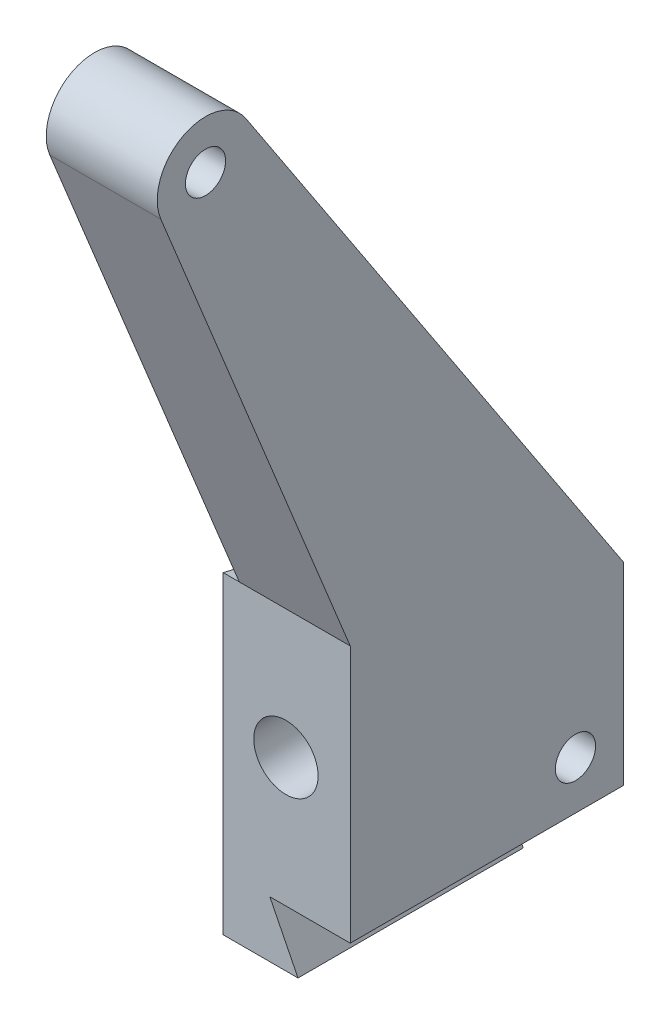
ISO-10303-21;
HEADER;
FILE_DESCRIPTION(('STEP AP214'),'2;1');
FILE_NAME('part.step','',(''),(''),'','','');
FILE_SCHEMA(('AUTOMOTIVE_DESIGN { 1 0 10303 214 1 1 1 1 }'));
ENDSEC;
DATA;
#1=APPLICATION_CONTEXT('core data for automotive mechanical design processes');
#2=APPLICATION_PROTOCOL_DEFINITION('international standard','automotive_design',2000,#1);
#3=PRODUCT_CONTEXT('',#1,'mechanical');
#4=PRODUCT('Part','Part','',(#3));
#5=PRODUCT_RELATED_PRODUCT_CATEGORY('part','',(#4));
#6=PRODUCT_DEFINITION_FORMATION('','',#4);
#7=PRODUCT_DEFINITION_CONTEXT('part definition',#1,'design');
#8=PRODUCT_DEFINITION('design','',#6,#7);
#9=PRODUCT_DEFINITION_SHAPE('','',#8);
#10=(LENGTH_UNIT() NAMED_UNIT(*) SI_UNIT(.MILLI.,.METRE.));
#11=(NAMED_UNIT(*) PLANE_ANGLE_UNIT() SI_UNIT($,.RADIAN.));
#12=(NAMED_UNIT(*) SI_UNIT($,.STERADIAN.) SOLID_ANGLE_UNIT());
#13=UNCERTAINTY_MEASURE_WITH_UNIT(LENGTH_MEASURE(1.E-05),#10,'distance_accuracy_value','');
#14=(GEOMETRIC_REPRESENTATION_CONTEXT(3) GLOBAL_UNCERTAINTY_ASSIGNED_CONTEXT((#13)) GLOBAL_UNIT_ASSIGNED_CONTEXT((#10,
#11,#12)) REPRESENTATION_CONTEXT('',''));
#15=CARTESIAN_POINT('',(0.,0.,0.));
#16=DIRECTION('',(0.,0.,1.));
#17=DIRECTION('',(1.,0.,0.));
#18=AXIS2_PLACEMENT_3D('',#15,#16,#17);
#19=CARTESIAN_POINT('',(7.9,16.,0.));
#20=DIRECTION('',(0.,-0.550279315551789,0.834980643413878));
#21=DIRECTION('',(0.,-0.834980643413878,-0.550279315551789));
#22=AXIS2_PLACEMENT_3D('',#19,#20,#21);
#23=PLANE('',#22);
#24=DIRECTION('',(0.,-0.834980643413878,-0.550279315551789));
#25=VECTOR('',#24,1.);
#26=CARTESIAN_POINT('',(4.9,16.,0.));
#27=LINE('',#26,#25);
#28=CARTESIAN_POINT('',(4.9,40.2144386590025,15.9581001510019));
#29=VERTEX_POINT('',#28);
#30=CARTESIAN_POINT('',(4.9,16.,0.));
#31=VERTEX_POINT('',#30);
#32=EDGE_CURVE('E140',#29,#31,#27,.T.);
#33=ORIENTED_EDGE('',*,*,#32,.F.);
#34=DIRECTION('',(-1.,0.,0.));
#35=VECTOR('',#34,1.);
#36=CARTESIAN_POINT('',(4.9,40.2144386590025,15.9581001510019));
#37=LINE('',#36,#35);
#38=CARTESIAN_POINT('',(1.,40.2144386590025,15.9581001510019));
#39=VERTEX_POINT('',#38);
#40=EDGE_CURVE('E131',#29,#39,#37,.T.);
#41=ORIENTED_EDGE('',*,*,#40,.T.);
#42=DIRECTION('',(0.,-0.834980643413878,-0.550279315551789));
#43=VECTOR('',#42,1.);
#44=CARTESIAN_POINT('',(1.,51.6508379466554,23.4950580697584));
#45=LINE('',#44,#43);
#46=CARTESIAN_POINT('',(1.,51.6508379466554,23.4950580697584));
#47=VERTEX_POINT('',#46);
#48=EDGE_CURVE('E156',#47,#39,#45,.T.);
#49=ORIENTED_EDGE('',*,*,#48,.F.);
#50=DIRECTION('',(-1.,0.,0.));
#51=VECTOR('',#50,1.);
#52=CARTESIAN_POINT('',(7.9,51.6508379466554,23.4950580697584));
#53=LINE('',#52,#51);
#54=CARTESIAN_POINT('',(7.9,51.6508379466554,23.4950580697584));
#55=VERTEX_POINT('',#54);
#56=EDGE_CURVE('E234',#55,#47,#53,.T.);
#57=ORIENTED_EDGE('',*,*,#56,.F.);
#58=DIRECTION('',(0.,0.834980643413878,0.550279315551789));
#59=VECTOR('',#58,1.);
#60=CARTESIAN_POINT('',(7.9,16.,0.));
#61=LINE('',#60,#59);
#62=CARTESIAN_POINT('',(7.9,16.,0.));
#63=VERTEX_POINT('',#62);
#64=EDGE_CURVE('E214',#63,#55,#61,.T.);
#65=ORIENTED_EDGE('',*,*,#64,.F.);
#66=DIRECTION('',(-1.,0.,0.));
#67=VECTOR('',#66,1.);
#68=CARTESIAN_POINT('',(7.9,16.,0.));
#69=LINE('',#68,#67);
#70=EDGE_CURVE('E148',#63,#31,#69,.T.);
#71=ORIENTED_EDGE('',*,*,#70,.T.);
#72=EDGE_LOOP('',(#33,#41,#49,#57,#65,#71));
#73=FACE_BOUND('',#72,.T.);
#74=ADVANCED_FACE('F44',(#73),#23,.F.);
#75=CARTESIAN_POINT('',(7.9,50.,26.));
#76=DIRECTION('',(-1.,0.,0.));
#77=DIRECTION('',(0.,0.,1.));
#78=AXIS2_PLACEMENT_3D('',#75,#76,#77);
#79=CYLINDRICAL_SURFACE('',#78,3.);
#80=CARTESIAN_POINT('',(1.,50.,26.));
#81=DIRECTION('',(-1.,0.,0.));
#82=DIRECTION('',(0.,0.,1.));
#83=AXIS2_PLACEMENT_3D('',#80,#81,#82);
#84=CIRCLE('',#83,3.);
#85=CARTESIAN_POINT('',(1.,48.8666904256081,28.7776985813064));
#86=VERTEX_POINT('',#85);
#87=EDGE_CURVE('E162',#86,#47,#84,.T.);
#88=ORIENTED_EDGE('',*,*,#87,.F.);
#89=DIRECTION('',(-1.,0.,0.));
#90=VECTOR('',#89,1.);
#91=CARTESIAN_POINT('',(7.9,48.8666904256081,28.7776985813064));
#92=LINE('',#91,#90);
#93=CARTESIAN_POINT('',(7.9,48.8666904256081,28.7776985813064));
#94=VERTEX_POINT('',#93);
#95=EDGE_CURVE('E231',#94,#86,#92,.T.);
#96=ORIENTED_EDGE('',*,*,#95,.F.);
#97=CARTESIAN_POINT('',(7.9,50.,26.));
#98=DIRECTION('',(1.,0.,0.));
#99=DIRECTION('',(0.,0.,-1.));
#100=AXIS2_PLACEMENT_3D('',#97,#98,#99);
#101=CIRCLE('',#100,3.);
#102=EDGE_CURVE('E217',#55,#94,#101,.T.);
#103=ORIENTED_EDGE('',*,*,#102,.F.);
#104=ORIENTED_EDGE('',*,*,#56,.T.);
#105=EDGE_LOOP('',(#88,#96,#103,#104));
#106=FACE_BOUND('',#105,.T.);
#107=ADVANCED_FACE('F264',(#106),#79,.T.);
#108=CARTESIAN_POINT('',(7.9,20.,17.));
#109=DIRECTION('',(0.,0.37776985813064,-0.925899527102134));
#110=DIRECTION('',(0.,0.925899527102134,0.37776985813064));
#111=AXIS2_PLACEMENT_3D('',#108,#109,#110);
#112=PLANE('',#111);
#113=DIRECTION('',(0.,0.925899527102134,0.37776985813064));
#114=VECTOR('',#113,1.);
#115=CARTESIAN_POINT('',(1.,20.,17.));
#116=LINE('',#115,#114);
#117=CARTESIAN_POINT('',(1.,20.,17.));
#118=VERTEX_POINT('',#117);
#119=EDGE_CURVE('E160',#118,#86,#116,.T.);
#120=ORIENTED_EDGE('',*,*,#119,.F.);
#121=DIRECTION('',(-1.,0.,0.));
#122=VECTOR('',#121,1.);
#123=CARTESIAN_POINT('',(7.9,20.,17.));
#124=LINE('',#123,#122);
#125=CARTESIAN_POINT('',(7.9,20.,17.));
#126=VERTEX_POINT('',#125);
#127=EDGE_CURVE('E224',#126,#118,#124,.T.);
#128=ORIENTED_EDGE('',*,*,#127,.F.);
#129=DIRECTION('',(0.,-0.925899527102134,-0.37776985813064));
#130=VECTOR('',#129,1.);
#131=CARTESIAN_POINT('',(7.9,20.,17.));
#132=LINE('',#131,#130);
#133=EDGE_CURVE('E219',#94,#126,#132,.T.);
#134=ORIENTED_EDGE('',*,*,#133,.F.);
#135=ORIENTED_EDGE('',*,*,#95,.T.);
#136=EDGE_LOOP('',(#120,#128,#134,#135));
#137=FACE_BOUND('',#136,.T.);
#138=ADVANCED_FACE('F270',(#137),#112,.F.);
#139=CARTESIAN_POINT('',(7.9,50.,26.));
#140=DIRECTION('',(-1.,0.,0.));
#141=DIRECTION('',(0.,0.,1.));
#142=AXIS2_PLACEMENT_3D('',#139,#140,#141);
#143=CYLINDRICAL_SURFACE('',#142,1.25);
#144=CARTESIAN_POINT('',(7.9,50.,26.));
#145=DIRECTION('',(1.,0.,0.));
#146=DIRECTION('',(0.,0.,-1.));
#147=AXIS2_PLACEMENT_3D('',#144,#145,#146);
#148=CIRCLE('',#147,1.25);
#149=CARTESIAN_POINT('',(7.9,50.,24.75));
#150=VERTEX_POINT('',#149);
#151=EDGE_CURVE('E206',#150,#150,#148,.T.);
#152=ORIENTED_EDGE('',*,*,#151,.T.);
#153=EDGE_LOOP('',(#152));
#154=FACE_BOUND('',#153,.T.);
#155=CARTESIAN_POINT('',(1.,50.,26.));
#156=DIRECTION('',(-1.,0.,0.));
#157=DIRECTION('',(0.,0.,1.));
#158=AXIS2_PLACEMENT_3D('',#155,#156,#157);
#159=CIRCLE('',#158,1.25);
#160=CARTESIAN_POINT('',(1.,50.,27.25));
#161=VERTEX_POINT('',#160);
#162=EDGE_CURVE('E169',#161,#161,#159,.T.);
#163=ORIENTED_EDGE('',*,*,#162,.T.);
#164=EDGE_LOOP('',(#163));
#165=FACE_BOUND('',#164,.T.);
#166=ADVANCED_FACE('F247',(#154,#165),#143,.F.);
#167=CARTESIAN_POINT('',(4.9,0.,29.));
#168=DIRECTION('',(-0.894427190999916,-0.447213595499958,0.));
#169=DIRECTION('',(0.447213595499958,-0.894427190999916,0.));
#170=AXIS2_PLACEMENT_3D('',#167,#168,#169);
#171=PLANE('',#170);
#172=DIRECTION('',(0.447213595499958,-0.894427190999916,0.));
#173=VECTOR('',#172,1.);
#174=CARTESIAN_POINT('',(4.65,0.5,3.));
#175=LINE('',#174,#173);
#176=CARTESIAN_POINT('',(2.9,4.,3.));
#177=VERTEX_POINT('',#176);
#178=CARTESIAN_POINT('',(4.65,0.499999999999999,3.));
#179=VERTEX_POINT('',#178);
#180=EDGE_CURVE('E66',#177,#179,#175,.T.);
#181=ORIENTED_EDGE('',*,*,#180,.F.);
#182=DIRECTION('',(0.,0.,-1.));
#183=VECTOR('',#182,1.);
#184=CARTESIAN_POINT('',(2.9,4.,29.));
#185=LINE('',#184,#183);
#186=CARTESIAN_POINT('',(2.9,4.,17.));
#187=VERTEX_POINT('',#186);
#188=EDGE_CURVE('E202',#187,#177,#185,.T.);
#189=ORIENTED_EDGE('',*,*,#188,.F.);
#190=DIRECTION('',(-0.447213595499958,0.894427190999916,0.));
#191=VECTOR('',#190,1.);
#192=CARTESIAN_POINT('',(-2.5,14.8,17.));
#193=LINE('',#192,#191);
#194=CARTESIAN_POINT('',(4.65,0.499999999999999,17.));
#195=VERTEX_POINT('',#194);
#196=EDGE_CURVE('E238',#195,#187,#193,.T.);
#197=ORIENTED_EDGE('',*,*,#196,.F.);
#198=DIRECTION('',(0.,0.,-1.));
#199=VECTOR('',#198,1.);
#200=CARTESIAN_POINT('',(4.65,0.499999999999999,29.));
#201=LINE('',#200,#199);
#202=EDGE_CURVE('E52',#195,#179,#201,.T.);
#203=ORIENTED_EDGE('',*,*,#202,.T.);
#204=EDGE_LOOP('',(#181,#189,#197,#203));
#205=FACE_BOUND('',#204,.T.);
#206=ADVANCED_FACE('F292',(#205),#171,.F.);
#207=CARTESIAN_POINT('',(0.,0.5,29.));
#208=DIRECTION('',(0.,1.,0.));
#209=DIRECTION('',(-1.,0.,0.));
#210=AXIS2_PLACEMENT_3D('',#207,#208,#209);
#211=PLANE('',#210);
#212=DIRECTION('',(-1.,0.,0.));
#213=VECTOR('',#212,1.);
#214=CARTESIAN_POINT('',(0.,0.5,3.));
#215=LINE('',#214,#213);
#216=CARTESIAN_POINT('',(0.,0.5,3.));
#217=VERTEX_POINT('',#216);
#218=EDGE_CURVE('E171',#179,#217,#215,.T.);
#219=ORIENTED_EDGE('',*,*,#218,.F.);
#220=ORIENTED_EDGE('',*,*,#202,.F.);
#221=DIRECTION('',(1.,0.,0.));
#222=VECTOR('',#221,1.);
#223=CARTESIAN_POINT('',(7.9,0.5,17.));
#224=LINE('',#223,#222);
#225=CARTESIAN_POINT('',(0.,0.5,17.));
#226=VERTEX_POINT('',#225);
#227=EDGE_CURVE('E191',#226,#195,#224,.T.);
#228=ORIENTED_EDGE('',*,*,#227,.F.);
#229=DIRECTION('',(0.,0.,-1.));
#230=VECTOR('',#229,1.);
#231=CARTESIAN_POINT('',(0.,0.5,29.));
#232=LINE('',#231,#230);
#233=EDGE_CURVE('E186',#226,#217,#232,.T.);
#234=ORIENTED_EDGE('',*,*,#233,.T.);
#235=EDGE_LOOP('',(#219,#220,#228,#234));
#236=FACE_BOUND('',#235,.T.);
#237=ADVANCED_FACE('F288',(#236),#211,.F.);
#238=CARTESIAN_POINT('',(7.9,50.,26.));
#239=DIRECTION('',(1.,0.,0.));
#240=DIRECTION('',(0.,0.,-1.));
#241=AXIS2_PLACEMENT_3D('',#238,#239,#240);
#242=PLANE('',#241);
#243=CARTESIAN_POINT('',(7.9,7.,3.));
#244=DIRECTION('',(1.,0.,0.));
#245=DIRECTION('',(0.,0.,-1.));
#246=AXIS2_PLACEMENT_3D('',#243,#244,#245);
#247=CIRCLE('',#246,1.24999999999999);
#248=CARTESIAN_POINT('',(7.9,7.,1.75000000000001));
#249=VERTEX_POINT('',#248);
#250=EDGE_CURVE('E194',#249,#249,#247,.T.);
#251=ORIENTED_EDGE('',*,*,#250,.F.);
#252=EDGE_LOOP('',(#251));
#253=FACE_BOUND('',#252,.T.);
#254=DIRECTION('',(0.,0.,-1.));
#255=VECTOR('',#254,1.);
#256=CARTESIAN_POINT('',(7.9,4.,29.));
#257=LINE('',#256,#255);
#258=CARTESIAN_POINT('',(7.9,4.,17.));
#259=VERTEX_POINT('',#258);
#260=CARTESIAN_POINT('',(7.9,4.,0.));
#261=VERTEX_POINT('',#260);
#262=EDGE_CURVE('E203',#259,#261,#257,.T.);
#263=ORIENTED_EDGE('',*,*,#262,.T.);
#264=DIRECTION('',(0.,1.,0.));
#265=VECTOR('',#264,1.);
#266=CARTESIAN_POINT('',(7.9,0.,0.));
#267=LINE('',#266,#265);
#268=EDGE_CURVE('E212',#261,#63,#267,.T.);
#269=ORIENTED_EDGE('',*,*,#268,.T.);
#270=ORIENTED_EDGE('',*,*,#64,.T.);
#271=ORIENTED_EDGE('',*,*,#102,.T.);
#272=ORIENTED_EDGE('',*,*,#133,.T.);
#273=DIRECTION('',(0.,-1.,0.));
#274=VECTOR('',#273,1.);
#275=CARTESIAN_POINT('',(7.9,20.,17.));
#276=LINE('',#275,#274);
#277=EDGE_CURVE('E221',#126,#259,#276,.T.);
#278=ORIENTED_EDGE('',*,*,#277,.T.);
#279=EDGE_LOOP('',(#263,#269,#270,#271,#272,#278));
#280=FACE_BOUND('',#279,.T.);
#281=ORIENTED_EDGE('',*,*,#151,.F.);
#282=EDGE_LOOP('',(#281));
#283=FACE_BOUND('',#282,.T.);
#284=ADVANCED_FACE('F284',(#253,#280,#283),#242,.T.);
#285=CARTESIAN_POINT('',(0.,50.,26.));
#286=DIRECTION('',(1.,0.,0.));
#287=DIRECTION('',(0.,0.,-1.));
#288=AXIS2_PLACEMENT_3D('',#285,#286,#287);
#289=PLANE('',#288);
#290=CARTESIAN_POINT('',(0.,7.,3.));
#291=DIRECTION('',(1.,0.,0.));
#292=DIRECTION('',(0.,0.,-1.));
#293=AXIS2_PLACEMENT_3D('',#290,#291,#292);
#294=CIRCLE('',#293,1.25);
#295=CARTESIAN_POINT('',(0.,7.,1.75));
#296=VERTEX_POINT('',#295);
#297=EDGE_CURVE('E197',#296,#296,#294,.T.);
#298=ORIENTED_EDGE('',*,*,#297,.T.);
#299=EDGE_LOOP('',(#298));
#300=FACE_BOUND('',#299,.T.);
#301=DIRECTION('',(0.,0.229039333725547,0.973417168333576));
#302=VECTOR('',#301,1.);
#303=CARTESIAN_POINT('',(0.,16.,0.));
#304=LINE('',#303,#302);
#305=CARTESIAN_POINT('',(0.,18.7003235456845,11.4763750691592));
#306=VERTEX_POINT('',#305);
#307=CARTESIAN_POINT('',(0.,20.,17.));
#308=VERTEX_POINT('',#307);
#309=EDGE_CURVE('E155',#306,#308,#304,.T.);
#310=ORIENTED_EDGE('',*,*,#309,.F.);
#311=CARTESIAN_POINT('',(0.,31.8292396309544,2.33134568561204));
#312=DIRECTION('',(1.,0.,0.));
#313=DIRECTION('',(0.,0.,-1.));
#314=AXIS2_PLACEMENT_3D('',#311,#312,#313);
#315=CIRCLE('',#314,16.);
#316=CARTESIAN_POINT('',(0.,16.,0.));
#317=VERTEX_POINT('',#316);
#318=EDGE_CURVE('E152',#306,#317,#315,.T.);
#319=ORIENTED_EDGE('',*,*,#318,.T.);
#320=DIRECTION('',(0.,1.,0.));
#321=VECTOR('',#320,1.);
#322=CARTESIAN_POINT('',(0.,0.,0.));
#323=LINE('',#322,#321);
#324=CARTESIAN_POINT('',(0.,4.,0.));
#325=VERTEX_POINT('',#324);
#326=EDGE_CURVE('E211',#325,#317,#323,.T.);
#327=ORIENTED_EDGE('',*,*,#326,.F.);
#328=DIRECTION('',(0.,0.,-1.));
#329=VECTOR('',#328,1.);
#330=CARTESIAN_POINT('',(0.,4.,3.));
#331=LINE('',#330,#329);
#332=CARTESIAN_POINT('',(0.,4.,3.));
#333=VERTEX_POINT('',#332);
#334=EDGE_CURVE('E179',#333,#325,#331,.T.);
#335=ORIENTED_EDGE('',*,*,#334,.F.);
#336=DIRECTION('',(0.,1.,0.));
#337=VECTOR('',#336,1.);
#338=CARTESIAN_POINT('',(0.,4.,3.));
#339=LINE('',#338,#337);
#340=EDGE_CURVE('E173',#217,#333,#339,.T.);
#341=ORIENTED_EDGE('',*,*,#340,.F.);
#342=ORIENTED_EDGE('',*,*,#233,.F.);
#343=DIRECTION('',(0.,-1.,0.));
#344=VECTOR('',#343,1.);
#345=CARTESIAN_POINT('',(0.,20.,17.));
#346=LINE('',#345,#344);
#347=EDGE_CURVE('E215',#308,#226,#346,.T.);
#348=ORIENTED_EDGE('',*,*,#347,.F.);
#349=EDGE_LOOP('',(#310,#319,#327,#335,#341,#342,#348));
#350=FACE_BOUND('',#349,.T.);
#351=ADVANCED_FACE('F282',(#300,#350),#289,.F.);
#352=CARTESIAN_POINT('',(7.9,0.,0.));
#353=DIRECTION('',(0.,0.,1.));
#354=DIRECTION('',(1.,0.,0.));
#355=AXIS2_PLACEMENT_3D('',#352,#353,#354);
#356=PLANE('',#355);
#357=CARTESIAN_POINT('',(3.9,12.,0.));
#358=DIRECTION('',(0.,0.,1.));
#359=DIRECTION('',(1.,0.,0.));
#360=AXIS2_PLACEMENT_3D('',#357,#358,#359);
#361=CIRCLE('',#360,2.);
#362=CARTESIAN_POINT('',(5.9,12.,0.));
#363=VERTEX_POINT('',#362);
#364=EDGE_CURVE('E183',#363,#363,#361,.T.);
#365=ORIENTED_EDGE('',*,*,#364,.T.);
#366=EDGE_LOOP('',(#365));
#367=FACE_BOUND('',#366,.T.);
#368=DIRECTION('',(1.,0.,0.));
#369=VECTOR('',#368,1.);
#370=CARTESIAN_POINT('',(2.9,4.,0.));
#371=LINE('',#370,#369);
#372=EDGE_CURVE('E200',#325,#261,#371,.T.);
#373=ORIENTED_EDGE('',*,*,#372,.F.);
#374=ORIENTED_EDGE('',*,*,#326,.T.);
#375=DIRECTION('',(-1.,0.,0.));
#376=VECTOR('',#375,1.);
#377=CARTESIAN_POINT('',(1.,16.,0.));
#378=LINE('',#377,#376);
#379=EDGE_CURVE('E164',#31,#317,#378,.T.);
#380=ORIENTED_EDGE('',*,*,#379,.F.);
#381=ORIENTED_EDGE('',*,*,#70,.F.);
#382=ORIENTED_EDGE('',*,*,#268,.F.);
#383=EDGE_LOOP('',(#373,#374,#380,#381,#382));
#384=FACE_BOUND('',#383,.T.);
#385=ADVANCED_FACE('F46',(#367,#384),#356,.F.);
#386=CARTESIAN_POINT('',(7.9,20.,17.));
#387=DIRECTION('',(0.,0.,-1.));
#388=DIRECTION('',(0.,1.,0.));
#389=AXIS2_PLACEMENT_3D('',#386,#387,#388);
#390=PLANE('',#389);
#391=CARTESIAN_POINT('',(3.9,12.,17.));
#392=DIRECTION('',(0.,0.,1.));
#393=DIRECTION('',(1.,0.,0.));
#394=AXIS2_PLACEMENT_3D('',#391,#392,#393);
#395=CIRCLE('',#394,2.);
#396=CARTESIAN_POINT('',(5.9,12.,17.));
#397=VERTEX_POINT('',#396);
#398=EDGE_CURVE('E182',#397,#397,#395,.T.);
#399=ORIENTED_EDGE('',*,*,#398,.F.);
#400=EDGE_LOOP('',(#399));
#401=FACE_BOUND('',#400,.T.);
#402=ORIENTED_EDGE('',*,*,#347,.T.);
#403=ORIENTED_EDGE('',*,*,#227,.T.);
#404=ORIENTED_EDGE('',*,*,#196,.T.);
#405=DIRECTION('',(1.,0.,0.));
#406=VECTOR('',#405,1.);
#407=CARTESIAN_POINT('',(7.9,4.,17.));
#408=LINE('',#407,#406);
#409=EDGE_CURVE('E240',#187,#259,#408,.T.);
#410=ORIENTED_EDGE('',*,*,#409,.T.);
#411=ORIENTED_EDGE('',*,*,#277,.F.);
#412=ORIENTED_EDGE('',*,*,#127,.T.);
#413=DIRECTION('',(-1.,0.,0.));
#414=VECTOR('',#413,1.);
#415=CARTESIAN_POINT('',(1.,20.,17.));
#416=LINE('',#415,#414);
#417=EDGE_CURVE('E166',#118,#308,#416,.T.);
#418=ORIENTED_EDGE('',*,*,#417,.T.);
#419=EDGE_LOOP('',(#402,#403,#404,#410,#411,#412,#418));
#420=FACE_BOUND('',#419,.T.);
#421=ADVANCED_FACE('F277',(#401,#420),#390,.F.);
#422=CARTESIAN_POINT('',(2.9,4.,29.));
#423=DIRECTION('',(0.,1.,0.));
#424=DIRECTION('',(-1.,0.,0.));
#425=AXIS2_PLACEMENT_3D('',#422,#423,#424);
#426=PLANE('',#425);
#427=ORIENTED_EDGE('',*,*,#188,.T.);
#428=DIRECTION('',(1.,0.,0.));
#429=VECTOR('',#428,1.);
#430=CARTESIAN_POINT('',(2.9,4.,3.));
#431=LINE('',#430,#429);
#432=EDGE_CURVE('E176',#333,#177,#431,.T.);
#433=ORIENTED_EDGE('',*,*,#432,.F.);
#434=ORIENTED_EDGE('',*,*,#334,.T.);
#435=ORIENTED_EDGE('',*,*,#372,.T.);
#436=ORIENTED_EDGE('',*,*,#262,.F.);
#437=ORIENTED_EDGE('',*,*,#409,.F.);
#438=EDGE_LOOP('',(#427,#433,#434,#435,#436,#437));
#439=FACE_BOUND('',#438,.T.);
#440=ADVANCED_FACE('F280',(#439),#426,.F.);
#441=CARTESIAN_POINT('',(7.9,7.,3.));
#442=DIRECTION('',(1.,0.,0.));
#443=DIRECTION('',(0.,0.,-1.));
#444=AXIS2_PLACEMENT_3D('',#441,#442,#443);
#445=CYLINDRICAL_SURFACE('',#444,1.24999999999999);
#446=ORIENTED_EDGE('',*,*,#297,.F.);
#447=EDGE_LOOP('',(#446));
#448=FACE_BOUND('',#447,.T.);
#449=ORIENTED_EDGE('',*,*,#250,.T.);
#450=EDGE_LOOP('',(#449));
#451=FACE_BOUND('',#450,.T.);
#452=ADVANCED_FACE('F299',(#448,#451),#445,.F.);
#453=CARTESIAN_POINT('',(3.9,12.,0.));
#454=DIRECTION('',(0.,0.,1.));
#455=DIRECTION('',(1.,0.,0.));
#456=AXIS2_PLACEMENT_3D('',#453,#454,#455);
#457=CYLINDRICAL_SURFACE('',#456,2.);
#458=ORIENTED_EDGE('',*,*,#364,.F.);
#459=EDGE_LOOP('',(#458));
#460=FACE_BOUND('',#459,.T.);
#461=ORIENTED_EDGE('',*,*,#398,.T.);
#462=EDGE_LOOP('',(#461));
#463=FACE_BOUND('',#462,.T.);
#464=ADVANCED_FACE('F303',(#460,#463),#457,.F.);
#465=CARTESIAN_POINT('',(0.,0.,3.));
#466=DIRECTION('',(0.,0.,-1.));
#467=DIRECTION('',(-1.,0.,0.));
#468=AXIS2_PLACEMENT_3D('',#465,#466,#467);
#469=PLANE('',#468);
#470=ORIENTED_EDGE('',*,*,#218,.T.);
#471=ORIENTED_EDGE('',*,*,#340,.T.);
#472=ORIENTED_EDGE('',*,*,#432,.T.);
#473=ORIENTED_EDGE('',*,*,#180,.T.);
#474=EDGE_LOOP('',(#470,#471,#472,#473));
#475=FACE_BOUND('',#474,.T.);
#476=ADVANCED_FACE('F260',(#475),#469,.T.);
#477=CARTESIAN_POINT('',(1.,16.,0.));
#478=DIRECTION('',(0.,-0.973417168333576,0.229039333725547));
#479=DIRECTION('',(0.,-0.229039333725547,-0.973417168333576));
#480=AXIS2_PLACEMENT_3D('',#477,#478,#479);
#481=PLANE('',#480);
#482=DIRECTION('',(0.,0.229039333725547,0.973417168333576));
#483=VECTOR('',#482,1.);
#484=CARTESIAN_POINT('',(1.,16.,0.));
#485=LINE('',#484,#483);
#486=CARTESIAN_POINT('',(1.,18.7003235456845,11.4763750691592));
#487=VERTEX_POINT('',#486);
#488=EDGE_CURVE('E158',#487,#118,#485,.T.);
#489=ORIENTED_EDGE('',*,*,#488,.F.);
#490=DIRECTION('',(-1.,0.,0.));
#491=VECTOR('',#490,1.);
#492=CARTESIAN_POINT('',(4.9,18.7003235456845,11.4763750691592));
#493=LINE('',#492,#491);
#494=EDGE_CURVE('E58',#487,#306,#493,.T.);
#495=ORIENTED_EDGE('',*,*,#494,.T.);
#496=ORIENTED_EDGE('',*,*,#309,.T.);
#497=ORIENTED_EDGE('',*,*,#417,.F.);
#498=EDGE_LOOP('',(#489,#495,#496,#497));
#499=FACE_BOUND('',#498,.T.);
#500=ADVANCED_FACE('F251',(#499),#481,.F.);
#501=CARTESIAN_POINT('',(1.,50.,26.));
#502=DIRECTION('',(-1.,0.,0.));
#503=DIRECTION('',(0.,0.,1.));
#504=AXIS2_PLACEMENT_3D('',#501,#502,#503);
#505=PLANE('',#504);
#506=CARTESIAN_POINT('',(1.,31.8292396309544,2.33134568561204));
#507=DIRECTION('',(-1.,0.,0.));
#508=DIRECTION('',(0.,0.,1.));
#509=AXIS2_PLACEMENT_3D('',#506,#507,#508);
#510=CIRCLE('',#509,16.);
#511=EDGE_CURVE('E13',#487,#39,#510,.T.);
#512=ORIENTED_EDGE('',*,*,#511,.F.);
#513=ORIENTED_EDGE('',*,*,#488,.T.);
#514=ORIENTED_EDGE('',*,*,#119,.T.);
#515=ORIENTED_EDGE('',*,*,#87,.T.);
#516=ORIENTED_EDGE('',*,*,#48,.T.);
#517=EDGE_LOOP('',(#512,#513,#514,#515,#516));
#518=FACE_BOUND('',#517,.T.);
#519=ORIENTED_EDGE('',*,*,#162,.F.);
#520=EDGE_LOOP('',(#519));
#521=FACE_BOUND('',#520,.T.);
#522=ADVANCED_FACE('F249',(#518,#521),#505,.T.);
#523=CARTESIAN_POINT('',(4.9,31.8292396309544,2.33134568561204));
#524=DIRECTION('',(-1.,0.,0.));
#525=DIRECTION('',(0.,0.,1.));
#526=AXIS2_PLACEMENT_3D('',#523,#524,#525);
#527=CYLINDRICAL_SURFACE('',#526,16.);
#528=ORIENTED_EDGE('',*,*,#494,.F.);
#529=ORIENTED_EDGE('',*,*,#511,.T.);
#530=ORIENTED_EDGE('',*,*,#40,.F.);
#531=CARTESIAN_POINT('',(4.9,31.8292396309544,2.33134568561204));
#532=DIRECTION('',(-1.,0.,0.));
#533=DIRECTION('',(0.,0.,1.));
#534=AXIS2_PLACEMENT_3D('',#531,#532,#533);
#535=CIRCLE('',#534,16.);
#536=EDGE_CURVE('E134',#31,#29,#535,.T.);
#537=ORIENTED_EDGE('',*,*,#536,.F.);
#538=ORIENTED_EDGE('',*,*,#379,.T.);
#539=ORIENTED_EDGE('',*,*,#318,.F.);
#540=EDGE_LOOP('',(#528,#529,#530,#537,#538,#539));
#541=FACE_BOUND('',#540,.T.);
#542=ADVANCED_FACE('F133',(#541),#527,.F.);
#543=CARTESIAN_POINT('',(4.9,31.8292396309544,2.33134568561204));
#544=DIRECTION('',(-1.,0.,0.));
#545=DIRECTION('',(0.,0.,1.));
#546=AXIS2_PLACEMENT_3D('',#543,#544,#545);
#547=PLANE('',#546);
#548=ORIENTED_EDGE('',*,*,#536,.T.);
#549=ORIENTED_EDGE('',*,*,#32,.T.);
#550=EDGE_LOOP('',(#548,#549));
#551=FACE_BOUND('',#550,.T.);
#552=ADVANCED_FACE('F143',(#551),#547,.T.);
#553=CLOSED_SHELL('',(#74,#107,#138,#166,#206,#237,#284,#351,#385,#421,#440,#452,#464,#476,#500,
#522,#542,#552));
#554=MANIFOLD_SOLID_BREP('B2',#553);
#555=ADVANCED_BREP_SHAPE_REPRESENTATION('',(#18,#554),#14);
#556=SHAPE_DEFINITION_REPRESENTATION(#9,#555);
ENDSEC;
END-ISO-10303-21;
